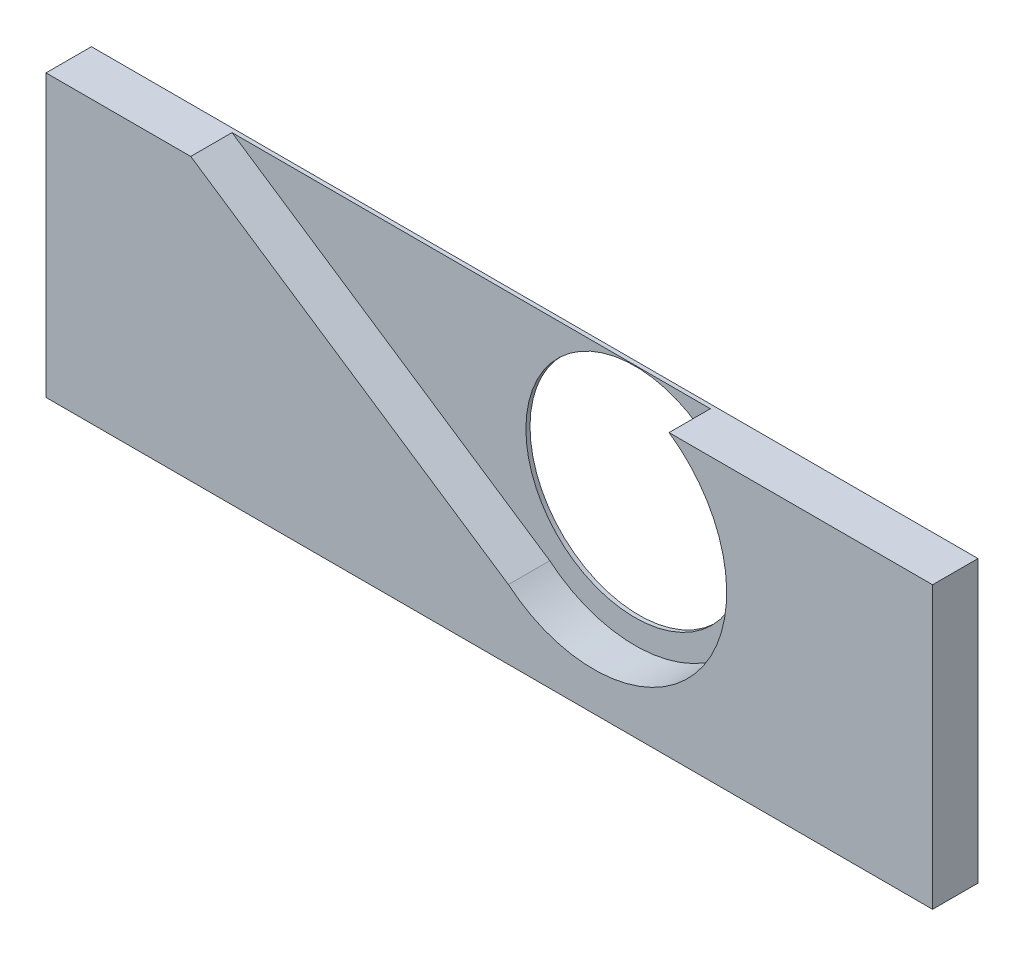
ISO-10303-21;
HEADER;
FILE_DESCRIPTION(('STEP AP214'),'2;1');
FILE_NAME('part.step','',(''),(''),'','','');
FILE_SCHEMA(('AUTOMOTIVE_DESIGN { 1 0 10303 214 1 1 1 1 }'));
ENDSEC;
DATA;
#1=APPLICATION_CONTEXT('core data for automotive mechanical design processes');
#2=APPLICATION_PROTOCOL_DEFINITION('international standard','automotive_design',2000,#1);
#3=PRODUCT_CONTEXT('',#1,'mechanical');
#4=PRODUCT('Part','Part','',(#3));
#5=PRODUCT_RELATED_PRODUCT_CATEGORY('part','',(#4));
#6=PRODUCT_DEFINITION_FORMATION('','',#4);
#7=PRODUCT_DEFINITION_CONTEXT('part definition',#1,'design');
#8=PRODUCT_DEFINITION('design','',#6,#7);
#9=PRODUCT_DEFINITION_SHAPE('','',#8);
#10=(LENGTH_UNIT() NAMED_UNIT(*) SI_UNIT(.MILLI.,.METRE.));
#11=(NAMED_UNIT(*) PLANE_ANGLE_UNIT() SI_UNIT($,.RADIAN.));
#12=(NAMED_UNIT(*) SI_UNIT($,.STERADIAN.) SOLID_ANGLE_UNIT());
#13=UNCERTAINTY_MEASURE_WITH_UNIT(LENGTH_MEASURE(1.E-05),#10,'distance_accuracy_value','');
#14=(GEOMETRIC_REPRESENTATION_CONTEXT(3) GLOBAL_UNCERTAINTY_ASSIGNED_CONTEXT((#13)) GLOBAL_UNIT_ASSIGNED_CONTEXT((#10,
#11,#12)) REPRESENTATION_CONTEXT('',''));
#15=CARTESIAN_POINT('',(0.,0.,0.));
#16=DIRECTION('',(0.,0.,1.));
#17=DIRECTION('',(1.,0.,0.));
#18=AXIS2_PLACEMENT_3D('',#15,#16,#17);
#19=CARTESIAN_POINT('',(0.,0.,0.));
#20=DIRECTION('',(0.,0.,-1.));
#21=DIRECTION('',(-1.,0.,0.));
#22=AXIS2_PLACEMENT_3D('',#19,#20,#21);
#23=PLANE('',#22);
#24=DIRECTION('',(0.,-1.,0.));
#25=VECTOR('',#24,1.);
#26=CARTESIAN_POINT('',(0.,0.,0.));
#27=LINE('',#26,#25);
#28=CARTESIAN_POINT('',(0.,33.02,0.));
#29=VERTEX_POINT('',#28);
#30=CARTESIAN_POINT('',(0.,0.,0.));
#31=VERTEX_POINT('',#30);
#32=EDGE_CURVE('E127',#29,#31,#27,.T.);
#33=ORIENTED_EDGE('',*,*,#32,.F.);
#34=DIRECTION('',(-1.,0.,0.));
#35=VECTOR('',#34,1.);
#36=CARTESIAN_POINT('',(0.,33.02,0.));
#37=LINE('',#36,#35);
#38=CARTESIAN_POINT('',(104.14,33.02,0.));
#39=VERTEX_POINT('',#38);
#40=EDGE_CURVE('E77',#39,#29,#37,.T.);
#41=ORIENTED_EDGE('',*,*,#40,.F.);
#42=DIRECTION('',(0.,1.,0.));
#43=VECTOR('',#42,1.);
#44=CARTESIAN_POINT('',(104.14,0.,0.));
#45=LINE('',#44,#43);
#46=CARTESIAN_POINT('',(104.14,0.,0.));
#47=VERTEX_POINT('',#46);
#48=EDGE_CURVE('E140',#47,#39,#45,.T.);
#49=ORIENTED_EDGE('',*,*,#48,.F.);
#50=DIRECTION('',(1.,0.,0.));
#51=VECTOR('',#50,1.);
#52=CARTESIAN_POINT('',(0.,0.,0.));
#53=LINE('',#52,#51);
#54=EDGE_CURVE('E138',#31,#47,#53,.T.);
#55=ORIENTED_EDGE('',*,*,#54,.F.);
#56=EDGE_LOOP('',(#33,#41,#49,#55));
#57=FACE_BOUND('',#56,.T.);
#58=CARTESIAN_POINT('',(64.319453413721,20.142181245731,0.));
#59=DIRECTION('',(0.,0.,-1.));
#60=DIRECTION('',(-1.,0.,0.));
#61=AXIS2_PLACEMENT_3D('',#58,#59,#60);
#62=CIRCLE('',#61,12.8016);
#63=CARTESIAN_POINT('',(51.517853413721,20.142181245731,0.));
#64=VERTEX_POINT('',#63);
#65=EDGE_CURVE('E118',#64,#64,#62,.F.);
#66=ORIENTED_EDGE('',*,*,#65,.T.);
#67=EDGE_LOOP('',(#66));
#68=FACE_BOUND('',#67,.T.);
#69=ADVANCED_FACE('F33',(#57,#68),#23,.T.);
#70=CARTESIAN_POINT('',(0.,0.,5.334));
#71=DIRECTION('',(1.,0.,0.));
#72=DIRECTION('',(0.,0.,-1.));
#73=AXIS2_PLACEMENT_3D('',#70,#71,#72);
#74=PLANE('',#73);
#75=ORIENTED_EDGE('',*,*,#32,.T.);
#76=DIRECTION('',(0.,0.,-1.));
#77=VECTOR('',#76,1.);
#78=CARTESIAN_POINT('',(0.,0.,5.334));
#79=LINE('',#78,#77);
#80=CARTESIAN_POINT('',(0.,0.,5.334));
#81=VERTEX_POINT('',#80);
#82=EDGE_CURVE('E149',#81,#31,#79,.T.);
#83=ORIENTED_EDGE('',*,*,#82,.F.);
#84=DIRECTION('',(0.,-1.,0.));
#85=VECTOR('',#84,1.);
#86=CARTESIAN_POINT('',(0.,0.,5.334));
#87=LINE('',#86,#85);
#88=CARTESIAN_POINT('',(0.,33.02,5.334));
#89=VERTEX_POINT('',#88);
#90=EDGE_CURVE('E128',#89,#81,#87,.T.);
#91=ORIENTED_EDGE('',*,*,#90,.F.);
#92=DIRECTION('',(0.,0.,-1.));
#93=VECTOR('',#92,1.);
#94=CARTESIAN_POINT('',(0.,33.02,5.334));
#95=LINE('',#94,#93);
#96=EDGE_CURVE('E135',#89,#29,#95,.T.);
#97=ORIENTED_EDGE('',*,*,#96,.T.);
#98=EDGE_LOOP('',(#75,#83,#91,#97));
#99=FACE_BOUND('',#98,.T.);
#100=ADVANCED_FACE('F35',(#99),#74,.F.);
#101=CARTESIAN_POINT('',(0.,0.,5.334));
#102=DIRECTION('',(0.,1.,0.));
#103=DIRECTION('',(0.,0.,1.));
#104=AXIS2_PLACEMENT_3D('',#101,#102,#103);
#105=PLANE('',#104);
#106=ORIENTED_EDGE('',*,*,#54,.T.);
#107=DIRECTION('',(0.,0.,-1.));
#108=VECTOR('',#107,1.);
#109=CARTESIAN_POINT('',(104.14,0.,5.334));
#110=LINE('',#109,#108);
#111=CARTESIAN_POINT('',(104.14,0.,5.334));
#112=VERTEX_POINT('',#111);
#113=EDGE_CURVE('E146',#112,#47,#110,.T.);
#114=ORIENTED_EDGE('',*,*,#113,.F.);
#115=DIRECTION('',(1.,0.,0.));
#116=VECTOR('',#115,1.);
#117=CARTESIAN_POINT('',(0.,0.,5.334));
#118=LINE('',#117,#116);
#119=EDGE_CURVE('E85',#81,#112,#118,.T.);
#120=ORIENTED_EDGE('',*,*,#119,.F.);
#121=ORIENTED_EDGE('',*,*,#82,.T.);
#122=EDGE_LOOP('',(#106,#114,#120,#121));
#123=FACE_BOUND('',#122,.T.);
#124=ADVANCED_FACE('F160',(#123),#105,.F.);
#125=CARTESIAN_POINT('',(104.14,0.,5.334));
#126=DIRECTION('',(-1.,0.,0.));
#127=DIRECTION('',(0.,0.,1.));
#128=AXIS2_PLACEMENT_3D('',#125,#126,#127);
#129=PLANE('',#128);
#130=ORIENTED_EDGE('',*,*,#48,.T.);
#131=DIRECTION('',(0.,0.,-1.));
#132=VECTOR('',#131,1.);
#133=CARTESIAN_POINT('',(104.14,33.02,5.334));
#134=LINE('',#133,#132);
#135=CARTESIAN_POINT('',(104.14,33.02,5.334));
#136=VERTEX_POINT('',#135);
#137=EDGE_CURVE('E144',#136,#39,#134,.T.);
#138=ORIENTED_EDGE('',*,*,#137,.F.);
#139=DIRECTION('',(0.,1.,0.));
#140=VECTOR('',#139,1.);
#141=CARTESIAN_POINT('',(104.14,0.,5.334));
#142=LINE('',#141,#140);
#143=EDGE_CURVE('E131',#112,#136,#142,.T.);
#144=ORIENTED_EDGE('',*,*,#143,.F.);
#145=ORIENTED_EDGE('',*,*,#113,.T.);
#146=EDGE_LOOP('',(#130,#138,#144,#145));
#147=FACE_BOUND('',#146,.T.);
#148=ADVANCED_FACE('F163',(#147),#129,.F.);
#149=CARTESIAN_POINT('',(0.,33.02,5.334));
#150=DIRECTION('',(0.,-1.,0.));
#151=DIRECTION('',(0.,0.,-1.));
#152=AXIS2_PLACEMENT_3D('',#149,#150,#151);
#153=PLANE('',#152);
#154=DIRECTION('',(-1.,0.,0.));
#155=VECTOR('',#154,1.);
#156=CARTESIAN_POINT('',(0.,33.02,5.334));
#157=LINE('',#156,#155);
#158=CARTESIAN_POINT('',(17.0004975317497,33.02,5.334));
#159=VERTEX_POINT('',#158);
#160=EDGE_CURVE('E55',#159,#89,#157,.T.);
#161=ORIENTED_EDGE('',*,*,#160,.F.);
#162=DIRECTION('',(0.,0.,-1.));
#163=VECTOR('',#162,1.);
#164=CARTESIAN_POINT('',(17.0004975317497,33.02,5.334));
#165=LINE('',#164,#163);
#166=CARTESIAN_POINT('',(17.0004975317497,33.02,0.482600000000001));
#167=VERTEX_POINT('',#166);
#168=EDGE_CURVE('E125',#159,#167,#165,.T.);
#169=ORIENTED_EDGE('',*,*,#168,.T.);
#170=DIRECTION('',(1.,0.,0.));
#171=VECTOR('',#170,1.);
#172=CARTESIAN_POINT('',(0.,33.02,0.482600000000001));
#173=LINE('',#172,#171);
#174=CARTESIAN_POINT('',(73.1836713613009,33.02,0.482600000000001));
#175=VERTEX_POINT('',#174);
#176=EDGE_CURVE('E11',#167,#175,#173,.T.);
#177=ORIENTED_EDGE('',*,*,#176,.T.);
#178=DIRECTION('',(0.,0.,1.));
#179=VECTOR('',#178,1.);
#180=CARTESIAN_POINT('',(73.1836713613009,33.02,0.482600000000001));
#181=LINE('',#180,#179);
#182=CARTESIAN_POINT('',(73.1836713613009,33.02,5.334));
#183=VERTEX_POINT('',#182);
#184=EDGE_CURVE('E108',#183,#175,#181,.F.);
#185=ORIENTED_EDGE('',*,*,#184,.F.);
#186=EDGE_CURVE('E133',#136,#183,#157,.T.);
#187=ORIENTED_EDGE('',*,*,#186,.F.);
#188=ORIENTED_EDGE('',*,*,#137,.T.);
#189=ORIENTED_EDGE('',*,*,#40,.T.);
#190=ORIENTED_EDGE('',*,*,#96,.F.);
#191=EDGE_LOOP('',(#161,#169,#177,#185,#187,#188,#189,#190));
#192=FACE_BOUND('',#191,.T.);
#193=ADVANCED_FACE('F153',(#192),#153,.F.);
#194=CARTESIAN_POINT('',(0.,0.,5.334));
#195=DIRECTION('',(0.,0.,-1.));
#196=DIRECTION('',(-1.,0.,0.));
#197=AXIS2_PLACEMENT_3D('',#194,#195,#196);
#198=PLANE('',#197);
#199=ORIENTED_EDGE('',*,*,#119,.T.);
#200=ORIENTED_EDGE('',*,*,#143,.T.);
#201=ORIENTED_EDGE('',*,*,#186,.T.);
#202=CARTESIAN_POINT('',(64.319453413721,20.142181245731,5.334));
#203=DIRECTION('',(0.,0.,-1.));
#204=DIRECTION('',(-1.,0.,0.));
#205=AXIS2_PLACEMENT_3D('',#202,#203,#204);
#206=CIRCLE('',#205,15.6337);
#207=CARTESIAN_POINT('',(54.3142670603064,8.1293205654664,5.334));
#208=VERTEX_POINT('',#207);
#209=EDGE_CURVE('E150',#208,#183,#206,.F.);
#210=ORIENTED_EDGE('',*,*,#209,.F.);
#211=DIRECTION('',(-0.831897632783627,0.554929120310872,0.));
#212=VECTOR('',#211,1.);
#213=CARTESIAN_POINT('',(20.478732994307,30.6997936796473,5.334));
#214=LINE('',#213,#212);
#215=EDGE_CURVE('E41',#208,#159,#214,.T.);
#216=ORIENTED_EDGE('',*,*,#215,.T.);
#217=ORIENTED_EDGE('',*,*,#160,.T.);
#218=ORIENTED_EDGE('',*,*,#90,.T.);
#219=EDGE_LOOP('',(#199,#200,#201,#210,#216,#217,#218));
#220=FACE_BOUND('',#219,.T.);
#221=ADVANCED_FACE('F152',(#220),#198,.F.);
#222=CARTESIAN_POINT('',(64.319453413721,20.142181245731,0.482600000000001));
#223=DIRECTION('',(0.,0.,-1.));
#224=DIRECTION('',(-0.463631123124594,-0.886028318774421,0.));
#225=AXIS2_PLACEMENT_3D('',#222,#223,#224);
#226=PLANE('',#225);
#227=CARTESIAN_POINT('',(64.319453413721,20.142181245731,0.482600000000001));
#228=DIRECTION('',(0.,0.,-1.));
#229=DIRECTION('',(-0.463631123124594,-0.886028318774421,0.));
#230=AXIS2_PLACEMENT_3D('',#227,#228,#229);
#231=CIRCLE('',#230,12.8016);
#232=CARTESIAN_POINT('',(58.3842332279292,8.79960112010833,0.482600000000001));
#233=VERTEX_POINT('',#232);
#234=EDGE_CURVE('E110',#233,#233,#231,.T.);
#235=ORIENTED_EDGE('',*,*,#234,.T.);
#236=EDGE_LOOP('',(#235));
#237=FACE_BOUND('',#236,.T.);
#238=DIRECTION('',(-0.831897632783627,0.554929120310872,0.));
#239=VECTOR('',#238,1.);
#240=CARTESIAN_POINT('',(57.071183524128,6.2902803185073,0.482600000000001));
#241=LINE('',#240,#239);
#242=CARTESIAN_POINT('',(54.3142670603064,8.12932056546639,0.482600000000001));
#243=VERTEX_POINT('',#242);
#244=EDGE_CURVE('E113',#243,#167,#241,.T.);
#245=ORIENTED_EDGE('',*,*,#244,.F.);
#246=CARTESIAN_POINT('',(64.319453413721,20.142181245731,0.482600000000001));
#247=DIRECTION('',(0.,0.,-1.));
#248=DIRECTION('',(-0.463631123124594,-0.886028318774421,0.));
#249=AXIS2_PLACEMENT_3D('',#246,#247,#248);
#250=CIRCLE('',#249,15.6337);
#251=EDGE_CURVE('E101',#175,#243,#250,.T.);
#252=ORIENTED_EDGE('',*,*,#251,.F.);
#253=ORIENTED_EDGE('',*,*,#176,.F.);
#254=EDGE_LOOP('',(#245,#252,#253));
#255=FACE_BOUND('',#254,.T.);
#256=ADVANCED_FACE('F114',(#237,#255),#226,.F.);
#257=CARTESIAN_POINT('',(57.071183524128,6.2902803185073,9.6266));
#258=DIRECTION('',(-0.554929120310872,-0.831897632783627,0.));
#259=DIRECTION('',(0.831897632783627,-0.554929120310872,0.));
#260=AXIS2_PLACEMENT_3D('',#257,#258,#259);
#261=PLANE('',#260);
#262=ORIENTED_EDGE('',*,*,#215,.F.);
#263=DIRECTION('',(0.,0.,1.));
#264=VECTOR('',#263,1.);
#265=CARTESIAN_POINT('',(54.3142670603064,8.1293205654664,0.482600000000001));
#266=LINE('',#265,#264);
#267=EDGE_CURVE('E105',#208,#243,#266,.F.);
#268=ORIENTED_EDGE('',*,*,#267,.T.);
#269=ORIENTED_EDGE('',*,*,#244,.T.);
#270=ORIENTED_EDGE('',*,*,#168,.F.);
#271=EDGE_LOOP('',(#262,#268,#269,#270));
#272=FACE_BOUND('',#271,.T.);
#273=ADVANCED_FACE('F117',(#272),#261,.F.);
#274=CARTESIAN_POINT('',(64.319453413721,20.142181245731,0.482600000000001));
#275=DIRECTION('',(0.,0.,1.));
#276=DIRECTION('',(0.463631123124594,0.886028318774421,0.));
#277=AXIS2_PLACEMENT_3D('',#274,#275,#276);
#278=CYLINDRICAL_SURFACE('',#277,15.6337);
#279=ORIENTED_EDGE('',*,*,#184,.T.);
#280=ORIENTED_EDGE('',*,*,#251,.T.);
#281=ORIENTED_EDGE('',*,*,#267,.F.);
#282=ORIENTED_EDGE('',*,*,#209,.T.);
#283=EDGE_LOOP('',(#279,#280,#281,#282));
#284=FACE_BOUND('',#283,.T.);
#285=ADVANCED_FACE('F103',(#284),#278,.F.);
#286=CARTESIAN_POINT('',(64.319453413721,20.142181245731,-4.8006));
#287=DIRECTION('',(0.,0.,1.));
#288=DIRECTION('',(0.463631123124594,0.886028318774421,0.));
#289=AXIS2_PLACEMENT_3D('',#286,#287,#288);
#290=CYLINDRICAL_SURFACE('',#289,12.8016);
#291=ORIENTED_EDGE('',*,*,#65,.F.);
#292=EDGE_LOOP('',(#291));
#293=FACE_BOUND('',#292,.T.);
#294=ORIENTED_EDGE('',*,*,#234,.F.);
#295=EDGE_LOOP('',(#294));
#296=FACE_BOUND('',#295,.T.);
#297=ADVANCED_FACE('F171',(#293,#296),#290,.F.);
#298=CLOSED_SHELL('',(#69,#100,#124,#148,#193,#221,#256,#273,#285,#297));
#299=MANIFOLD_SOLID_BREP('B2',#298);
#300=ADVANCED_BREP_SHAPE_REPRESENTATION('',(#18,#299),#14);
#301=SHAPE_DEFINITION_REPRESENTATION(#9,#300);
ENDSEC;
END-ISO-10303-21;
